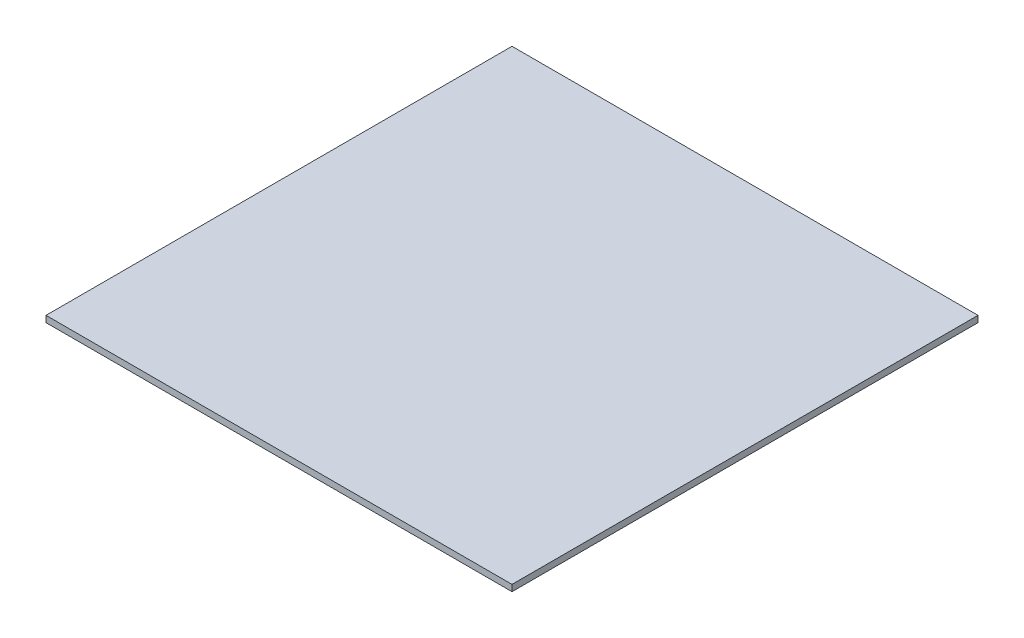
ISO-10303-21;
HEADER;
FILE_DESCRIPTION(('STEP AP214'),'2;1');
FILE_NAME('part.step','',(''),(''),'','','');
FILE_SCHEMA(('AUTOMOTIVE_DESIGN { 1 0 10303 214 1 1 1 1 }'));
ENDSEC;
DATA;
#1=APPLICATION_CONTEXT('core data for automotive mechanical design processes');
#2=APPLICATION_PROTOCOL_DEFINITION('international standard','automotive_design',2000,#1);
#3=PRODUCT_CONTEXT('',#1,'mechanical');
#4=PRODUCT('Part','Part','',(#3));
#5=PRODUCT_RELATED_PRODUCT_CATEGORY('part','',(#4));
#6=PRODUCT_DEFINITION_FORMATION('','',#4);
#7=PRODUCT_DEFINITION_CONTEXT('part definition',#1,'design');
#8=PRODUCT_DEFINITION('design','',#6,#7);
#9=PRODUCT_DEFINITION_SHAPE('','',#8);
#10=(LENGTH_UNIT() NAMED_UNIT(*) SI_UNIT(.MILLI.,.METRE.));
#11=(NAMED_UNIT(*) PLANE_ANGLE_UNIT() SI_UNIT($,.RADIAN.));
#12=(NAMED_UNIT(*) SI_UNIT($,.STERADIAN.) SOLID_ANGLE_UNIT());
#13=UNCERTAINTY_MEASURE_WITH_UNIT(LENGTH_MEASURE(1.E-05),#10,'distance_accuracy_value','');
#14=(GEOMETRIC_REPRESENTATION_CONTEXT(3) GLOBAL_UNCERTAINTY_ASSIGNED_CONTEXT((#13)) GLOBAL_UNIT_ASSIGNED_CONTEXT((#10,
#11,#12)) REPRESENTATION_CONTEXT('',''));
#15=CARTESIAN_POINT('',(0.,0.,0.));
#16=DIRECTION('',(0.,0.,1.));
#17=DIRECTION('',(1.,0.,0.));
#18=AXIS2_PLACEMENT_3D('',#15,#16,#17);
#19=CARTESIAN_POINT('',(-11.,0.3,-11.));
#20=DIRECTION('',(1.,0.,0.));
#21=DIRECTION('',(0.,0.,-1.));
#22=AXIS2_PLACEMENT_3D('',#19,#20,#21);
#23=PLANE('',#22);
#24=DIRECTION('',(0.,0.,1.));
#25=VECTOR('',#24,1.);
#26=CARTESIAN_POINT('',(-11.,0.,-11.));
#27=LINE('',#26,#25);
#28=CARTESIAN_POINT('',(-11.,0.,-11.));
#29=VERTEX_POINT('',#28);
#30=CARTESIAN_POINT('',(-11.,0.,11.));
#31=VERTEX_POINT('',#30);
#32=EDGE_CURVE('E100',#29,#31,#27,.T.);
#33=ORIENTED_EDGE('',*,*,#32,.T.);
#34=DIRECTION('',(0.,-1.,0.));
#35=VECTOR('',#34,1.);
#36=CARTESIAN_POINT('',(-11.,0.3,11.));
#37=LINE('',#36,#35);
#38=CARTESIAN_POINT('',(-11.,0.3,11.));
#39=VERTEX_POINT('',#38);
#40=EDGE_CURVE('E11',#39,#31,#37,.T.);
#41=ORIENTED_EDGE('',*,*,#40,.F.);
#42=DIRECTION('',(0.,0.,1.));
#43=VECTOR('',#42,1.);
#44=CARTESIAN_POINT('',(-11.,0.3,-11.));
#45=LINE('',#44,#43);
#46=CARTESIAN_POINT('',(-11.,0.3,-11.));
#47=VERTEX_POINT('',#46);
#48=EDGE_CURVE('E88',#47,#39,#45,.T.);
#49=ORIENTED_EDGE('',*,*,#48,.F.);
#50=DIRECTION('',(0.,-1.,0.));
#51=VECTOR('',#50,1.);
#52=CARTESIAN_POINT('',(-11.,0.3,-11.));
#53=LINE('',#52,#51);
#54=EDGE_CURVE('E96',#47,#29,#53,.T.);
#55=ORIENTED_EDGE('',*,*,#54,.T.);
#56=EDGE_LOOP('',(#33,#41,#49,#55));
#57=FACE_BOUND('',#56,.T.);
#58=ADVANCED_FACE('F37',(#57),#23,.F.);
#59=CARTESIAN_POINT('',(11.,0.3,11.));
#60=DIRECTION('',(0.,0.,-1.));
#61=DIRECTION('',(-1.,0.,0.));
#62=AXIS2_PLACEMENT_3D('',#59,#60,#61);
#63=PLANE('',#62);
#64=DIRECTION('',(1.,0.,0.));
#65=VECTOR('',#64,1.);
#66=CARTESIAN_POINT('',(11.,0.,11.));
#67=LINE('',#66,#65);
#68=CARTESIAN_POINT('',(11.,0.,11.));
#69=VERTEX_POINT('',#68);
#70=EDGE_CURVE('E92',#31,#69,#67,.T.);
#71=ORIENTED_EDGE('',*,*,#70,.T.);
#72=DIRECTION('',(0.,-1.,0.));
#73=VECTOR('',#72,1.);
#74=CARTESIAN_POINT('',(11.,0.3,11.));
#75=LINE('',#74,#73);
#76=CARTESIAN_POINT('',(11.,0.3,11.));
#77=VERTEX_POINT('',#76);
#78=EDGE_CURVE('E45',#77,#69,#75,.T.);
#79=ORIENTED_EDGE('',*,*,#78,.F.);
#80=DIRECTION('',(1.,0.,0.));
#81=VECTOR('',#80,1.);
#82=CARTESIAN_POINT('',(11.,0.3,11.));
#83=LINE('',#82,#81);
#84=EDGE_CURVE('E83',#39,#77,#83,.T.);
#85=ORIENTED_EDGE('',*,*,#84,.F.);
#86=ORIENTED_EDGE('',*,*,#40,.T.);
#87=EDGE_LOOP('',(#71,#79,#85,#86));
#88=FACE_BOUND('',#87,.T.);
#89=ADVANCED_FACE('F91',(#88),#63,.F.);
#90=CARTESIAN_POINT('',(11.,0.3,-11.));
#91=DIRECTION('',(-1.,0.,0.));
#92=DIRECTION('',(0.,0.,1.));
#93=AXIS2_PLACEMENT_3D('',#90,#91,#92);
#94=PLANE('',#93);
#95=DIRECTION('',(0.,0.,-1.));
#96=VECTOR('',#95,1.);
#97=CARTESIAN_POINT('',(11.,0.,-11.));
#98=LINE('',#97,#96);
#99=CARTESIAN_POINT('',(11.,0.,-11.));
#100=VERTEX_POINT('',#99);
#101=EDGE_CURVE('E70',#69,#100,#98,.T.);
#102=ORIENTED_EDGE('',*,*,#101,.T.);
#103=DIRECTION('',(0.,-1.,0.));
#104=VECTOR('',#103,1.);
#105=CARTESIAN_POINT('',(11.,0.3,-11.));
#106=LINE('',#105,#104);
#107=CARTESIAN_POINT('',(11.,0.3,-11.));
#108=VERTEX_POINT('',#107);
#109=EDGE_CURVE('E93',#108,#100,#106,.T.);
#110=ORIENTED_EDGE('',*,*,#109,.F.);
#111=DIRECTION('',(0.,0.,-1.));
#112=VECTOR('',#111,1.);
#113=CARTESIAN_POINT('',(11.,0.3,-11.));
#114=LINE('',#113,#112);
#115=EDGE_CURVE('E86',#77,#108,#114,.T.);
#116=ORIENTED_EDGE('',*,*,#115,.F.);
#117=ORIENTED_EDGE('',*,*,#78,.T.);
#118=EDGE_LOOP('',(#102,#110,#116,#117));
#119=FACE_BOUND('',#118,.T.);
#120=ADVANCED_FACE('F94',(#119),#94,.F.);
#121=CARTESIAN_POINT('',(11.,0.3,-11.));
#122=DIRECTION('',(0.,0.,1.));
#123=DIRECTION('',(1.,0.,0.));
#124=AXIS2_PLACEMENT_3D('',#121,#122,#123);
#125=PLANE('',#124);
#126=DIRECTION('',(-1.,0.,0.));
#127=VECTOR('',#126,1.);
#128=CARTESIAN_POINT('',(11.,0.,-11.));
#129=LINE('',#128,#127);
#130=EDGE_CURVE('E76',#100,#29,#129,.T.);
#131=ORIENTED_EDGE('',*,*,#130,.T.);
#132=ORIENTED_EDGE('',*,*,#54,.F.);
#133=DIRECTION('',(-1.,0.,0.));
#134=VECTOR('',#133,1.);
#135=CARTESIAN_POINT('',(11.,0.3,-11.));
#136=LINE('',#135,#134);
#137=EDGE_CURVE('E53',#108,#47,#136,.T.);
#138=ORIENTED_EDGE('',*,*,#137,.F.);
#139=ORIENTED_EDGE('',*,*,#109,.T.);
#140=EDGE_LOOP('',(#131,#132,#138,#139));
#141=FACE_BOUND('',#140,.T.);
#142=ADVANCED_FACE('F107',(#141),#125,.F.);
#143=CARTESIAN_POINT('',(0.,0.3,0.));
#144=DIRECTION('',(0.,-1.,0.));
#145=DIRECTION('',(0.,0.,-1.));
#146=AXIS2_PLACEMENT_3D('',#143,#144,#145);
#147=PLANE('',#146);
#148=ORIENTED_EDGE('',*,*,#48,.T.);
#149=ORIENTED_EDGE('',*,*,#84,.T.);
#150=ORIENTED_EDGE('',*,*,#115,.T.);
#151=ORIENTED_EDGE('',*,*,#137,.T.);
#152=EDGE_LOOP('',(#148,#149,#150,#151));
#153=FACE_BOUND('',#152,.T.);
#154=ADVANCED_FACE('F84',(#153),#147,.F.);
#155=CARTESIAN_POINT('',(0.,0.,0.));
#156=DIRECTION('',(0.,-1.,0.));
#157=DIRECTION('',(0.,0.,-1.));
#158=AXIS2_PLACEMENT_3D('',#155,#156,#157);
#159=PLANE('',#158);
#160=ORIENTED_EDGE('',*,*,#32,.F.);
#161=ORIENTED_EDGE('',*,*,#130,.F.);
#162=ORIENTED_EDGE('',*,*,#101,.F.);
#163=ORIENTED_EDGE('',*,*,#70,.F.);
#164=EDGE_LOOP('',(#160,#161,#162,#163));
#165=FACE_BOUND('',#164,.T.);
#166=ADVANCED_FACE('F110',(#165),#159,.T.);
#167=CLOSED_SHELL('',(#58,#89,#120,#142,#154,#166));
#168=MANIFOLD_SOLID_BREP('B2',#167);
#169=ADVANCED_BREP_SHAPE_REPRESENTATION('',(#18,#168),#14);
#170=SHAPE_DEFINITION_REPRESENTATION(#9,#169);
ENDSEC;
END-ISO-10303-21;
